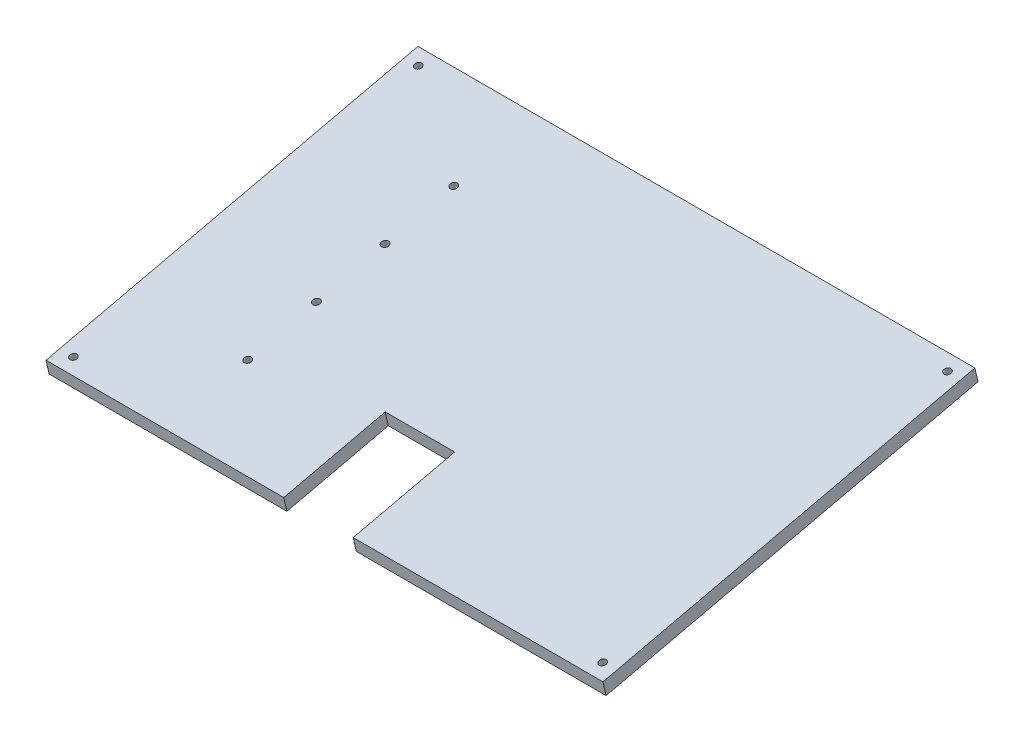
ISO-10303-21;
HEADER;
FILE_DESCRIPTION(('STEP AP214'),'2;1');
FILE_NAME('part.step','',(''),(''),'','','');
FILE_SCHEMA(('AUTOMOTIVE_DESIGN { 1 0 10303 214 1 1 1 1 }'));
ENDSEC;
DATA;
#1=APPLICATION_CONTEXT('core data for automotive mechanical design processes');
#2=APPLICATION_PROTOCOL_DEFINITION('international standard','automotive_design',2000,#1);
#3=PRODUCT_CONTEXT('',#1,'mechanical');
#4=PRODUCT('Part','Part','',(#3));
#5=PRODUCT_RELATED_PRODUCT_CATEGORY('part','',(#4));
#6=PRODUCT_DEFINITION_FORMATION('','',#4);
#7=PRODUCT_DEFINITION_CONTEXT('part definition',#1,'design');
#8=PRODUCT_DEFINITION('design','',#6,#7);
#9=PRODUCT_DEFINITION_SHAPE('','',#8);
#10=(LENGTH_UNIT() NAMED_UNIT(*) SI_UNIT(.MILLI.,.METRE.));
#11=(NAMED_UNIT(*) PLANE_ANGLE_UNIT() SI_UNIT($,.RADIAN.));
#12=(NAMED_UNIT(*) SI_UNIT($,.STERADIAN.) SOLID_ANGLE_UNIT());
#13=UNCERTAINTY_MEASURE_WITH_UNIT(LENGTH_MEASURE(1.E-05),#10,'distance_accuracy_value','');
#14=(GEOMETRIC_REPRESENTATION_CONTEXT(3) GLOBAL_UNCERTAINTY_ASSIGNED_CONTEXT((#13)) GLOBAL_UNIT_ASSIGNED_CONTEXT((#10,
#11,#12)) REPRESENTATION_CONTEXT('',''));
#15=CARTESIAN_POINT('',(0.,0.,0.));
#16=DIRECTION('',(0.,0.,1.));
#17=DIRECTION('',(1.,0.,0.));
#18=AXIS2_PLACEMENT_3D('',#15,#16,#17);
#19=CARTESIAN_POINT('',(-1069.36551774697,101.974773649402,545.336502329348));
#20=DIRECTION('',(0.,-0.974370064785234,-0.224951054343872));
#21=DIRECTION('',(1.,0.,0.));
#22=AXIS2_PLACEMENT_3D('',#19,#20,#21);
#23=CYLINDRICAL_SURFACE('',#22,2.54);
#24=CARTESIAN_POINT('',(-1069.36551774697,101.974773649402,545.336502329348));
#25=DIRECTION('',(0.,-0.974370064785234,-0.224951054343872));
#26=DIRECTION('',(1.,0.,0.));
#27=AXIS2_PLACEMENT_3D('',#24,#25,#26);
#28=CIRCLE('',#27,2.54);
#29=CARTESIAN_POINT('',(-1071.90551774697,101.974773649402,545.336502329348));
#30=VERTEX_POINT('',#29);
#31=EDGE_CURVE('E199',#30,#30,#28,.T.);
#32=ORIENTED_EDGE('',*,*,#31,.F.);
#33=DIRECTION('',(0.,-0.974370064785234,-0.224951054343872));
#34=VECTOR('',#33,1.);
#35=CARTESIAN_POINT('',(-1071.90551774697,101.974773649402,545.336502329348));
#36=LINE('',#35,#34);
#37=CARTESIAN_POINT('',(-1071.90551774697,92.2310730015492,543.086991785909));
#38=VERTEX_POINT('',#37);
#39=EDGE_CURVE('E10',#30,#38,#36,.T.);
#40=ORIENTED_EDGE('',*,*,#39,.T.);
#41=CARTESIAN_POINT('',(-1069.36551774697,92.2310730015493,543.086991785909));
#42=DIRECTION('',(0.,0.974370064785234,0.224951054343872));
#43=DIRECTION('',(1.,0.,0.));
#44=AXIS2_PLACEMENT_3D('',#41,#42,#43);
#45=CIRCLE('',#44,2.54);
#46=EDGE_CURVE('E188',#38,#38,#45,.T.);
#47=ORIENTED_EDGE('',*,*,#46,.F.);
#48=ORIENTED_EDGE('',*,*,#39,.F.);
#49=EDGE_LOOP('',(#32,#40,#47,#48));
#50=FACE_BOUND('',#49,.T.);
#51=ADVANCED_FACE('F16',(#50),#23,.F.);
#52=CARTESIAN_POINT('',(-1069.36551774697,113.40228721007,495.838503038258));
#53=DIRECTION('',(0.,-0.974370064785234,-0.224951054343872));
#54=DIRECTION('',(1.,0.,0.));
#55=AXIS2_PLACEMENT_3D('',#52,#53,#54);
#56=CYLINDRICAL_SURFACE('',#55,2.54);
#57=CARTESIAN_POINT('',(-1069.36551774697,113.40228721007,495.838503038258));
#58=DIRECTION('',(0.,-0.974370064785234,-0.224951054343872));
#59=DIRECTION('',(1.,0.,0.));
#60=AXIS2_PLACEMENT_3D('',#57,#58,#59);
#61=CIRCLE('',#60,2.54);
#62=CARTESIAN_POINT('',(-1071.90551774697,113.40228721007,495.838503038258));
#63=VERTEX_POINT('',#62);
#64=EDGE_CURVE('E175',#63,#63,#61,.T.);
#65=ORIENTED_EDGE('',*,*,#64,.F.);
#66=DIRECTION('',(0.,-0.974370064785234,-0.224951054343872));
#67=VECTOR('',#66,1.);
#68=CARTESIAN_POINT('',(-1071.90551774697,113.40228721007,495.838503038258));
#69=LINE('',#68,#67);
#70=CARTESIAN_POINT('',(-1071.90551774697,103.658586562218,493.588992494819));
#71=VERTEX_POINT('',#70);
#72=EDGE_CURVE('E27',#63,#71,#69,.T.);
#73=ORIENTED_EDGE('',*,*,#72,.T.);
#74=CARTESIAN_POINT('',(-1069.36551774697,103.658586562218,493.588992494819));
#75=DIRECTION('',(0.,0.974370064785234,0.224951054343872));
#76=DIRECTION('',(1.,0.,0.));
#77=AXIS2_PLACEMENT_3D('',#74,#75,#76);
#78=CIRCLE('',#77,2.54);
#79=EDGE_CURVE('E184',#71,#71,#78,.T.);
#80=ORIENTED_EDGE('',*,*,#79,.F.);
#81=ORIENTED_EDGE('',*,*,#72,.F.);
#82=EDGE_LOOP('',(#65,#73,#80,#81));
#83=FACE_BOUND('',#82,.T.);
#84=ADVANCED_FACE('F384',(#83),#56,.F.);
#85=CARTESIAN_POINT('',(-1069.36551774697,90.5472600887329,594.834501620438));
#86=DIRECTION('',(0.,-0.974370064785234,-0.224951054343872));
#87=DIRECTION('',(1.,0.,0.));
#88=AXIS2_PLACEMENT_3D('',#85,#86,#87);
#89=CYLINDRICAL_SURFACE('',#88,2.54);
#90=CARTESIAN_POINT('',(-1069.36551774697,90.547260088733,594.834501620438));
#91=DIRECTION('',(0.,-0.974370064785234,-0.224951054343872));
#92=DIRECTION('',(1.,0.,0.));
#93=AXIS2_PLACEMENT_3D('',#90,#91,#92);
#94=CIRCLE('',#93,2.54);
#95=CARTESIAN_POINT('',(-1071.90551774697,90.547260088733,594.834501620438));
#96=VERTEX_POINT('',#95);
#97=EDGE_CURVE('E170',#96,#96,#94,.T.);
#98=ORIENTED_EDGE('',*,*,#97,.F.);
#99=DIRECTION('',(0.,-0.974370064785234,-0.224951054343872));
#100=VECTOR('',#99,1.);
#101=CARTESIAN_POINT('',(-1071.90551774697,90.5472600887329,594.834501620438));
#102=LINE('',#101,#100);
#103=CARTESIAN_POINT('',(-1071.90551774697,80.8035594408805,592.584991076999));
#104=VERTEX_POINT('',#103);
#105=EDGE_CURVE('E180',#96,#104,#102,.T.);
#106=ORIENTED_EDGE('',*,*,#105,.T.);
#107=CARTESIAN_POINT('',(-1069.36551774697,80.8035594408807,592.584991076999));
#108=DIRECTION('',(0.,0.974370064785234,0.224951054343872));
#109=DIRECTION('',(1.,0.,0.));
#110=AXIS2_PLACEMENT_3D('',#107,#108,#109);
#111=CIRCLE('',#110,2.54);
#112=EDGE_CURVE('E189',#104,#104,#111,.T.);
#113=ORIENTED_EDGE('',*,*,#112,.F.);
#114=ORIENTED_EDGE('',*,*,#105,.F.);
#115=EDGE_LOOP('',(#98,#106,#113,#114));
#116=FACE_BOUND('',#115,.T.);
#117=ADVANCED_FACE('F379',(#116),#89,.F.);
#118=CARTESIAN_POINT('',(-1069.36551774697,124.829800770739,446.340503747168));
#119=DIRECTION('',(0.,-0.974370064785234,-0.224951054343872));
#120=DIRECTION('',(1.,0.,0.));
#121=AXIS2_PLACEMENT_3D('',#118,#119,#120);
#122=CYLINDRICAL_SURFACE('',#121,2.54);
#123=CARTESIAN_POINT('',(-1069.36551774697,124.829800770739,446.340503747168));
#124=DIRECTION('',(0.,-0.974370064785234,-0.224951054343872));
#125=DIRECTION('',(1.,0.,0.));
#126=AXIS2_PLACEMENT_3D('',#123,#124,#125);
#127=CIRCLE('',#126,2.54);
#128=CARTESIAN_POINT('',(-1071.90551774697,124.829800770739,446.340503747168));
#129=VERTEX_POINT('',#128);
#130=EDGE_CURVE('E174',#129,#129,#127,.T.);
#131=ORIENTED_EDGE('',*,*,#130,.F.);
#132=DIRECTION('',(0.,-0.974370064785234,-0.224951054343872));
#133=VECTOR('',#132,1.);
#134=CARTESIAN_POINT('',(-1071.90551774697,124.829800770739,446.340503747168));
#135=LINE('',#134,#133);
#136=CARTESIAN_POINT('',(-1071.90551774697,115.086100122887,444.090993203729));
#137=VERTEX_POINT('',#136);
#138=EDGE_CURVE('E176',#129,#137,#135,.T.);
#139=ORIENTED_EDGE('',*,*,#138,.T.);
#140=CARTESIAN_POINT('',(-1069.36551774697,115.086100122887,444.090993203729));
#141=DIRECTION('',(0.,0.974370064785234,0.224951054343872));
#142=DIRECTION('',(1.,0.,0.));
#143=AXIS2_PLACEMENT_3D('',#140,#141,#142);
#144=CIRCLE('',#143,2.54);
#145=EDGE_CURVE('E277',#137,#137,#144,.T.);
#146=ORIENTED_EDGE('',*,*,#145,.F.);
#147=ORIENTED_EDGE('',*,*,#138,.F.);
#148=EDGE_LOOP('',(#131,#139,#146,#147));
#149=FACE_BOUND('',#148,.T.);
#150=ADVANCED_FACE('F611',(#149),#122,.F.);
#151=CARTESIAN_POINT('',(-984.124223131464,76.8702359846253,654.07620155938));
#152=DIRECTION('',(0.,0.224951054343872,-0.974370064785234));
#153=DIRECTION('',(-1.,0.,0.));
#154=AXIS2_PLACEMENT_3D('',#151,#152,#153);
#155=PLANE('',#154);
#156=DIRECTION('',(0.,-0.974370064785234,-0.224951054343872));
#157=VECTOR('',#156,1.);
#158=CARTESIAN_POINT('',(-1155.4504158531,76.8702359846252,654.07620155938));
#159=LINE('',#158,#157);
#160=CARTESIAN_POINT('',(-1155.4504158531,76.870235984625,654.07620155938));
#161=VERTEX_POINT('',#160);
#162=CARTESIAN_POINT('',(-1155.4504158531,67.126535336773,651.826691015941));
#163=VERTEX_POINT('',#162);
#164=EDGE_CURVE('E257',#161,#163,#159,.T.);
#165=ORIENTED_EDGE('',*,*,#164,.T.);
#166=DIRECTION('',(1.,0.,0.));
#167=VECTOR('',#166,1.);
#168=CARTESIAN_POINT('',(-1160.4504158531,67.126535336773,651.826691015941));
#169=LINE('',#168,#167);
#170=CARTESIAN_POINT('',(-984.124223131464,67.126535336773,651.826691015941));
#171=VERTEX_POINT('',#170);
#172=EDGE_CURVE('E214',#163,#171,#169,.T.);
#173=ORIENTED_EDGE('',*,*,#172,.T.);
#174=DIRECTION('',(0.,-0.974370064785233,-0.224951054343875));
#175=VECTOR('',#174,1.);
#176=CARTESIAN_POINT('',(-984.124223131464,76.8702359846253,654.07620155938));
#177=LINE('',#176,#175);
#178=CARTESIAN_POINT('',(-984.124223131464,76.8702359846253,654.07620155938));
#179=VERTEX_POINT('',#178);
#180=EDGE_CURVE('E20',#179,#171,#177,.T.);
#181=ORIENTED_EDGE('',*,*,#180,.F.);
#182=DIRECTION('',(1.,0.,0.));
#183=VECTOR('',#182,1.);
#184=CARTESIAN_POINT('',(-1160.4504158531,76.8702359846253,654.07620155938));
#185=LINE('',#184,#183);
#186=EDGE_CURVE('E222',#161,#179,#185,.T.);
#187=ORIENTED_EDGE('',*,*,#186,.F.);
#188=EDGE_LOOP('',(#165,#173,#181,#187));
#189=FACE_BOUND('',#188,.T.);
#190=ADVANCED_FACE('F352',(#189),#155,.F.);
#191=CARTESIAN_POINT('',(-984.124223131464,93.7415650604157,580.998446700488));
#192=DIRECTION('',(-1.,0.,0.));
#193=DIRECTION('',(0.,1.,0.));
#194=AXIS2_PLACEMENT_3D('',#191,#192,#193);
#195=PLANE('',#194);
#196=DIRECTION('',(0.,0.224951054343872,-0.974370064785234));
#197=VECTOR('',#196,1.);
#198=CARTESIAN_POINT('',(-984.124223131464,67.126535336773,651.826691015941));
#199=LINE('',#198,#197);
#200=CARTESIAN_POINT('',(-984.124223131464,83.9978644125634,578.748936157049));
#201=VERTEX_POINT('',#200);
#202=EDGE_CURVE('E211',#171,#201,#199,.T.);
#203=ORIENTED_EDGE('',*,*,#202,.T.);
#204=DIRECTION('',(0.,-0.974370064785234,-0.224951054343869));
#205=VECTOR('',#204,1.);
#206=CARTESIAN_POINT('',(-984.124223131464,93.7415650604157,580.998446700488));
#207=LINE('',#206,#205);
#208=CARTESIAN_POINT('',(-984.124223131464,93.7415650604157,580.998446700488));
#209=VERTEX_POINT('',#208);
#210=EDGE_CURVE('E103',#209,#201,#207,.T.);
#211=ORIENTED_EDGE('',*,*,#210,.F.);
#212=DIRECTION('',(0.,0.224951054343872,-0.974370064785234));
#213=VECTOR('',#212,1.);
#214=CARTESIAN_POINT('',(-984.124223131464,76.8702359846253,654.07620155938));
#215=LINE('',#214,#213);
#216=EDGE_CURVE('E225',#179,#209,#215,.T.);
#217=ORIENTED_EDGE('',*,*,#216,.F.);
#218=ORIENTED_EDGE('',*,*,#180,.T.);
#219=EDGE_LOOP('',(#203,#211,#217,#218));
#220=FACE_BOUND('',#219,.T.);
#221=ADVANCED_FACE('F409',(#220),#195,.F.);
#222=CARTESIAN_POINT('',(-934.124223131464,93.7415650604157,580.998446700488));
#223=DIRECTION('',(0.,0.224951054343872,-0.974370064785234));
#224=DIRECTION('',(-1.,0.,0.));
#225=AXIS2_PLACEMENT_3D('',#222,#223,#224);
#226=PLANE('',#225);
#227=DIRECTION('',(1.,0.,0.));
#228=VECTOR('',#227,1.);
#229=CARTESIAN_POINT('',(-984.124223131464,83.9978644125634,578.748936157049));
#230=LINE('',#229,#228);
#231=CARTESIAN_POINT('',(-934.124223131464,83.9978644125634,578.748936157049));
#232=VERTEX_POINT('',#231);
#233=EDGE_CURVE('E183',#201,#232,#230,.T.);
#234=ORIENTED_EDGE('',*,*,#233,.T.);
#235=DIRECTION('',(0.,-0.974370064785234,-0.224951054343869));
#236=VECTOR('',#235,1.);
#237=CARTESIAN_POINT('',(-934.124223131464,93.7415650604157,580.998446700488));
#238=LINE('',#237,#236);
#239=CARTESIAN_POINT('',(-934.124223131464,93.7415650604157,580.998446700488));
#240=VERTEX_POINT('',#239);
#241=EDGE_CURVE('E302',#240,#232,#238,.T.);
#242=ORIENTED_EDGE('',*,*,#241,.F.);
#243=DIRECTION('',(1.,0.,0.));
#244=VECTOR('',#243,1.);
#245=CARTESIAN_POINT('',(-984.124223131464,93.7415650604157,580.998446700488));
#246=LINE('',#245,#244);
#247=EDGE_CURVE('E162',#209,#240,#246,.T.);
#248=ORIENTED_EDGE('',*,*,#247,.F.);
#249=ORIENTED_EDGE('',*,*,#210,.T.);
#250=EDGE_LOOP('',(#234,#242,#248,#249));
#251=FACE_BOUND('',#250,.T.);
#252=ADVANCED_FACE('F406',(#251),#226,.F.);
#253=CARTESIAN_POINT('',(-934.124223131464,76.8702359846253,654.07620155938));
#254=DIRECTION('',(1.,0.,0.));
#255=DIRECTION('',(0.,1.,0.));
#256=AXIS2_PLACEMENT_3D('',#253,#254,#255);
#257=PLANE('',#256);
#258=DIRECTION('',(0.,-0.224951054343872,0.974370064785234));
#259=VECTOR('',#258,1.);
#260=CARTESIAN_POINT('',(-934.124223131464,83.9978644125634,578.748936157049));
#261=LINE('',#260,#259);
#262=CARTESIAN_POINT('',(-934.124223131464,67.126535336773,651.826691015941));
#263=VERTEX_POINT('',#262);
#264=EDGE_CURVE('E126',#232,#263,#261,.T.);
#265=ORIENTED_EDGE('',*,*,#264,.T.);
#266=DIRECTION('',(0.,-0.974370064785233,-0.224951054343875));
#267=VECTOR('',#266,1.);
#268=CARTESIAN_POINT('',(-934.124223131464,76.8702359846253,654.07620155938));
#269=LINE('',#268,#267);
#270=CARTESIAN_POINT('',(-934.124223131464,76.8702359846253,654.07620155938));
#271=VERTEX_POINT('',#270);
#272=EDGE_CURVE('E203',#271,#263,#269,.T.);
#273=ORIENTED_EDGE('',*,*,#272,.F.);
#274=DIRECTION('',(0.,-0.224951054343872,0.974370064785234));
#275=VECTOR('',#274,1.);
#276=CARTESIAN_POINT('',(-934.124223131464,93.7415650604157,580.998446700488));
#277=LINE('',#276,#275);
#278=EDGE_CURVE('E251',#240,#271,#277,.T.);
#279=ORIENTED_EDGE('',*,*,#278,.F.);
#280=ORIENTED_EDGE('',*,*,#241,.T.);
#281=EDGE_LOOP('',(#265,#273,#279,#280));
#282=FACE_BOUND('',#281,.T.);
#283=ADVANCED_FACE('F387',(#282),#257,.F.);
#284=CARTESIAN_POINT('',(0.,206.600739847275,47.6975390937449));
#285=DIRECTION('',(0.,0.974370064785234,0.224951054343872));
#286=DIRECTION('',(1.,0.,0.));
#287=AXIS2_PLACEMENT_3D('',#284,#285,#286);
#288=PLANE('',#287);
#289=ORIENTED_EDGE('',*,*,#46,.T.);
#290=EDGE_LOOP('',(#289));
#291=FACE_BOUND('',#290,.T.);
#292=ORIENTED_EDGE('',*,*,#79,.T.);
#293=EDGE_LOOP('',(#292));
#294=FACE_BOUND('',#293,.T.);
#295=ORIENTED_EDGE('',*,*,#112,.T.);
#296=EDGE_LOOP('',(#295));
#297=FACE_BOUND('',#296,.T.);
#298=ORIENTED_EDGE('',*,*,#145,.T.);
#299=EDGE_LOOP('',(#298));
#300=FACE_BOUND('',#299,.T.);
#301=CARTESIAN_POINT('',(-764.124223131464,69.3760458802115,642.082990368089));
#302=DIRECTION('',(0.,0.974370064785234,0.224951054343872));
#303=DIRECTION('',(1.,0.,0.));
#304=AXIS2_PLACEMENT_3D('',#301,#302,#303);
#305=CIRCLE('',#304,2.5);
#306=CARTESIAN_POINT('',(-766.624223131464,69.3760458802116,642.082990368089));
#307=VERTEX_POINT('',#306);
#308=EDGE_CURVE('E194',#307,#307,#305,.T.);
#309=ORIENTED_EDGE('',*,*,#308,.T.);
#310=EDGE_LOOP('',(#309));
#311=FACE_BOUND('',#310,.T.);
#312=CARTESIAN_POINT('',(-1145.4504158531,126.738564737899,393.618623847855));
#313=DIRECTION('',(0.,0.974370064785234,0.224951054343872));
#314=DIRECTION('',(1.,0.,0.));
#315=AXIS2_PLACEMENT_3D('',#312,#313,#314);
#316=CIRCLE('',#315,2.5);
#317=CARTESIAN_POINT('',(-1147.9504158531,126.738564737899,393.618623847855));
#318=VERTEX_POINT('',#317);
#319=EDGE_CURVE('E168',#318,#318,#316,.T.);
#320=ORIENTED_EDGE('',*,*,#319,.T.);
#321=EDGE_LOOP('',(#320));
#322=FACE_BOUND('',#321,.T.);
#323=CARTESIAN_POINT('',(-1145.4504158531,69.3760458802117,642.082990368089));
#324=DIRECTION('',(0.,0.974370064785234,0.224951054343872));
#325=DIRECTION('',(1.,0.,0.));
#326=AXIS2_PLACEMENT_3D('',#323,#324,#325);
#327=CIRCLE('',#326,2.5);
#328=CARTESIAN_POINT('',(-1147.9504158531,69.3760458802117,642.082990368089));
#329=VERTEX_POINT('',#328);
#330=EDGE_CURVE('E262',#329,#329,#327,.T.);
#331=ORIENTED_EDGE('',*,*,#330,.T.);
#332=EDGE_LOOP('',(#331));
#333=FACE_BOUND('',#332,.T.);
#334=CARTESIAN_POINT('',(-764.124223131464,126.738564737899,393.618623847854));
#335=DIRECTION('',(0.,0.974370064785234,0.224951054343872));
#336=DIRECTION('',(1.,0.,0.));
#337=AXIS2_PLACEMENT_3D('',#334,#335,#336);
#338=CIRCLE('',#337,2.5);
#339=CARTESIAN_POINT('',(-766.624223131464,126.738564737899,393.618623847855));
#340=VERTEX_POINT('',#339);
#341=EDGE_CURVE('E149',#340,#340,#338,.T.);
#342=ORIENTED_EDGE('',*,*,#341,.T.);
#343=EDGE_LOOP('',(#342));
#344=FACE_BOUND('',#343,.T.);
#345=DIRECTION('',(0.,0.224951054343872,-0.974370064785234));
#346=VECTOR('',#345,1.);
#347=CARTESIAN_POINT('',(-1155.4504158531,167.794407564307,215.786231146874));
#348=LINE('',#347,#346);
#349=CARTESIAN_POINT('',(-1155.4504158531,128.988075281338,383.874923200002));
#350=VERTEX_POINT('',#349);
#351=EDGE_CURVE('E261',#163,#350,#348,.T.);
#352=ORIENTED_EDGE('',*,*,#351,.T.);
#353=DIRECTION('',(-1.,0.,0.));
#354=VECTOR('',#353,1.);
#355=CARTESIAN_POINT('',(-749.124223131464,128.988075281338,383.874923200002));
#356=LINE('',#355,#354);
#357=CARTESIAN_POINT('',(-754.124223131464,128.988075281338,383.874923200002));
#358=VERTEX_POINT('',#357);
#359=EDGE_CURVE('E226',#358,#350,#356,.T.);
#360=ORIENTED_EDGE('',*,*,#359,.F.);
#361=DIRECTION('',(0.,-0.224951054343872,0.974370064785234));
#362=VECTOR('',#361,1.);
#363=CARTESIAN_POINT('',(-754.124223131464,136.863637592024,349.762115054843));
#364=LINE('',#363,#362);
#365=CARTESIAN_POINT('',(-754.124223131464,67.1265353367728,651.826691015941));
#366=VERTEX_POINT('',#365);
#367=EDGE_CURVE('E210',#358,#366,#364,.T.);
#368=ORIENTED_EDGE('',*,*,#367,.T.);
#369=DIRECTION('',(1.,0.,0.));
#370=VECTOR('',#369,1.);
#371=CARTESIAN_POINT('',(-934.124223131464,67.126535336773,651.826691015941));
#372=LINE('',#371,#370);
#373=EDGE_CURVE('E200',#263,#366,#372,.T.);
#374=ORIENTED_EDGE('',*,*,#373,.F.);
#375=ORIENTED_EDGE('',*,*,#264,.F.);
#376=ORIENTED_EDGE('',*,*,#233,.F.);
#377=ORIENTED_EDGE('',*,*,#202,.F.);
#378=ORIENTED_EDGE('',*,*,#172,.F.);
#379=EDGE_LOOP('',(#352,#360,#368,#374,#375,#376,#377,#378));
#380=FACE_BOUND('',#379,.T.);
#381=ADVANCED_FACE('F333',(#291,#294,#297,#300,#311,#322,#333,#344,#380),#288,.F.);
#382=CARTESIAN_POINT('',(0.,216.344440495127,49.9470496371837));
#383=DIRECTION('',(0.,0.974370064785234,0.224951054343872));
#384=DIRECTION('',(1.,0.,0.));
#385=AXIS2_PLACEMENT_3D('',#382,#383,#384);
#386=PLANE('',#385);
#387=CARTESIAN_POINT('',(-764.124223131464,136.482265385751,395.868134391293));
#388=DIRECTION('',(0.,-0.974370064785234,-0.224951054343872));
#389=DIRECTION('',(1.,0.,0.));
#390=AXIS2_PLACEMENT_3D('',#387,#388,#389);
#391=CIRCLE('',#390,2.5);
#392=CARTESIAN_POINT('',(-766.624223131464,136.482265385751,395.868134391293));
#393=VERTEX_POINT('',#392);
#394=EDGE_CURVE('E148',#393,#393,#391,.T.);
#395=ORIENTED_EDGE('',*,*,#394,.T.);
#396=EDGE_LOOP('',(#395));
#397=FACE_BOUND('',#396,.T.);
#398=CARTESIAN_POINT('',(-1145.4504158531,79.1197465280637,644.332500911527));
#399=DIRECTION('',(0.,-0.974370064785234,-0.224951054343872));
#400=DIRECTION('',(1.,0.,0.));
#401=AXIS2_PLACEMENT_3D('',#398,#399,#400);
#402=CIRCLE('',#401,2.5);
#403=CARTESIAN_POINT('',(-1147.9504158531,79.1197465280638,644.332500911527));
#404=VERTEX_POINT('',#403);
#405=EDGE_CURVE('E242',#404,#404,#402,.T.);
#406=ORIENTED_EDGE('',*,*,#405,.T.);
#407=EDGE_LOOP('',(#406));
#408=FACE_BOUND('',#407,.T.);
#409=CARTESIAN_POINT('',(-1145.4504158531,136.482265385751,395.868134391293));
#410=DIRECTION('',(0.,-0.974370064785234,-0.224951054343872));
#411=DIRECTION('',(1.,0.,0.));
#412=AXIS2_PLACEMENT_3D('',#409,#410,#411);
#413=CIRCLE('',#412,2.5);
#414=CARTESIAN_POINT('',(-1147.9504158531,136.482265385751,395.868134391293));
#415=VERTEX_POINT('',#414);
#416=EDGE_CURVE('E169',#415,#415,#413,.T.);
#417=ORIENTED_EDGE('',*,*,#416,.T.);
#418=EDGE_LOOP('',(#417));
#419=FACE_BOUND('',#418,.T.);
#420=CARTESIAN_POINT('',(-764.124223131464,79.1197465280636,644.332500911527));
#421=DIRECTION('',(0.,-0.974370064785234,-0.224951054343872));
#422=DIRECTION('',(1.,0.,0.));
#423=AXIS2_PLACEMENT_3D('',#420,#421,#422);
#424=CIRCLE('',#423,2.5);
#425=CARTESIAN_POINT('',(-766.624223131464,79.1197465280636,644.332500911527));
#426=VERTEX_POINT('',#425);
#427=EDGE_CURVE('E195',#426,#426,#424,.T.);
#428=ORIENTED_EDGE('',*,*,#427,.T.);
#429=EDGE_LOOP('',(#428));
#430=FACE_BOUND('',#429,.T.);
#431=ORIENTED_EDGE('',*,*,#130,.T.);
#432=EDGE_LOOP('',(#431));
#433=FACE_BOUND('',#432,.T.);
#434=ORIENTED_EDGE('',*,*,#97,.T.);
#435=EDGE_LOOP('',(#434));
#436=FACE_BOUND('',#435,.T.);
#437=ORIENTED_EDGE('',*,*,#64,.T.);
#438=EDGE_LOOP('',(#437));
#439=FACE_BOUND('',#438,.T.);
#440=ORIENTED_EDGE('',*,*,#31,.T.);
#441=EDGE_LOOP('',(#440));
#442=FACE_BOUND('',#441,.T.);
#443=DIRECTION('',(0.,-0.224951054343872,0.974370064785234));
#444=VECTOR('',#443,1.);
#445=CARTESIAN_POINT('',(-1155.4504158531,177.538108212159,218.035741690312));
#446=LINE('',#445,#444);
#447=CARTESIAN_POINT('',(-1155.4504158531,138.73177592919,386.124433743441));
#448=VERTEX_POINT('',#447);
#449=EDGE_CURVE('E247',#448,#161,#446,.T.);
#450=ORIENTED_EDGE('',*,*,#449,.T.);
#451=ORIENTED_EDGE('',*,*,#186,.T.);
#452=ORIENTED_EDGE('',*,*,#216,.T.);
#453=ORIENTED_EDGE('',*,*,#247,.T.);
#454=ORIENTED_EDGE('',*,*,#278,.T.);
#455=DIRECTION('',(1.,0.,0.));
#456=VECTOR('',#455,1.);
#457=CARTESIAN_POINT('',(-934.124223131464,76.8702359846253,654.07620155938));
#458=LINE('',#457,#456);
#459=CARTESIAN_POINT('',(-754.124223131464,76.8702359846249,654.07620155938));
#460=VERTEX_POINT('',#459);
#461=EDGE_CURVE('E301',#271,#460,#458,.T.);
#462=ORIENTED_EDGE('',*,*,#461,.T.);
#463=DIRECTION('',(0.,0.224951054343872,-0.974370064785234));
#464=VECTOR('',#463,1.);
#465=CARTESIAN_POINT('',(-754.124223131464,146.607338239876,352.011625598282));
#466=LINE('',#465,#464);
#467=CARTESIAN_POINT('',(-754.124223131464,138.73177592919,386.124433743441));
#468=VERTEX_POINT('',#467);
#469=EDGE_CURVE('E209',#460,#468,#466,.T.);
#470=ORIENTED_EDGE('',*,*,#469,.T.);
#471=DIRECTION('',(-1.,0.,0.));
#472=VECTOR('',#471,1.);
#473=CARTESIAN_POINT('',(-749.124223131464,138.73177592919,386.124433743441));
#474=LINE('',#473,#472);
#475=EDGE_CURVE('E202',#468,#448,#474,.T.);
#476=ORIENTED_EDGE('',*,*,#475,.T.);
#477=EDGE_LOOP('',(#450,#451,#452,#453,#454,#462,#470,#476));
#478=FACE_BOUND('',#477,.T.);
#479=ADVANCED_FACE('F153',(#397,#408,#419,#430,#433,#436,#439,#442,#478),#386,.T.);
#480=CARTESIAN_POINT('',(-1160.4504158531,138.73177592919,386.124433743441));
#481=DIRECTION('',(0.,-0.224951054343872,0.974370064785234));
#482=DIRECTION('',(-1.,0.,0.));
#483=AXIS2_PLACEMENT_3D('',#480,#481,#482);
#484=PLANE('',#483);
#485=DIRECTION('',(0.,0.974370064785234,0.224951054343872));
#486=VECTOR('',#485,1.);
#487=CARTESIAN_POINT('',(-1155.4504158531,138.73177592919,386.124433743441));
#488=LINE('',#487,#486);
#489=EDGE_CURVE('E243',#350,#448,#488,.T.);
#490=ORIENTED_EDGE('',*,*,#489,.T.);
#491=ORIENTED_EDGE('',*,*,#475,.F.);
#492=DIRECTION('',(0.,-0.974370064785234,-0.224951054343872));
#493=VECTOR('',#492,1.);
#494=CARTESIAN_POINT('',(-754.124223131464,138.73177592919,386.124433743441));
#495=LINE('',#494,#493);
#496=EDGE_CURVE('E205',#468,#358,#495,.T.);
#497=ORIENTED_EDGE('',*,*,#496,.T.);
#498=ORIENTED_EDGE('',*,*,#359,.T.);
#499=EDGE_LOOP('',(#490,#491,#497,#498));
#500=FACE_BOUND('',#499,.T.);
#501=ADVANCED_FACE('F18',(#500),#484,.F.);
#502=CARTESIAN_POINT('',(-934.124223131464,76.8702359846253,654.07620155938));
#503=DIRECTION('',(0.,0.224951054343872,-0.974370064785234));
#504=DIRECTION('',(-1.,0.,0.));
#505=AXIS2_PLACEMENT_3D('',#502,#503,#504);
#506=PLANE('',#505);
#507=DIRECTION('',(0.,0.974370064785234,0.224951054343872));
#508=VECTOR('',#507,1.);
#509=CARTESIAN_POINT('',(-754.124223131464,76.8702359846251,654.07620155938));
#510=LINE('',#509,#508);
#511=EDGE_CURVE('E221',#366,#460,#510,.T.);
#512=ORIENTED_EDGE('',*,*,#511,.T.);
#513=ORIENTED_EDGE('',*,*,#461,.F.);
#514=ORIENTED_EDGE('',*,*,#272,.T.);
#515=ORIENTED_EDGE('',*,*,#373,.T.);
#516=EDGE_LOOP('',(#512,#513,#514,#515));
#517=FACE_BOUND('',#516,.T.);
#518=ADVANCED_FACE('F403',(#517),#506,.F.);
#519=CARTESIAN_POINT('',(-754.124223131464,76.8702359846249,654.07620155938));
#520=DIRECTION('',(-1.,0.,0.));
#521=DIRECTION('',(0.,0.,1.));
#522=AXIS2_PLACEMENT_3D('',#519,#520,#521);
#523=PLANE('',#522);
#524=ORIENTED_EDGE('',*,*,#367,.F.);
#525=ORIENTED_EDGE('',*,*,#496,.F.);
#526=ORIENTED_EDGE('',*,*,#469,.F.);
#527=ORIENTED_EDGE('',*,*,#511,.F.);
#528=EDGE_LOOP('',(#524,#525,#526,#527));
#529=FACE_BOUND('',#528,.T.);
#530=ADVANCED_FACE('F402',(#529),#523,.F.);
#531=CARTESIAN_POINT('',(-764.124223131464,79.1197465280636,644.332500911527));
#532=DIRECTION('',(0.,-0.974370064785234,-0.224951054343872));
#533=DIRECTION('',(1.,0.,0.));
#534=AXIS2_PLACEMENT_3D('',#531,#532,#533);
#535=CYLINDRICAL_SURFACE('',#534,2.5);
#536=ORIENTED_EDGE('',*,*,#427,.F.);
#537=DIRECTION('',(0.,-0.974370064785234,-0.224951054343872));
#538=VECTOR('',#537,1.);
#539=CARTESIAN_POINT('',(-766.624223131464,79.1197465280636,644.332500911527));
#540=LINE('',#539,#538);
#541=EDGE_CURVE('E190',#426,#307,#540,.T.);
#542=ORIENTED_EDGE('',*,*,#541,.T.);
#543=ORIENTED_EDGE('',*,*,#308,.F.);
#544=ORIENTED_EDGE('',*,*,#541,.F.);
#545=EDGE_LOOP('',(#536,#542,#543,#544));
#546=FACE_BOUND('',#545,.T.);
#547=ADVANCED_FACE('F584',(#546),#535,.F.);
#548=CARTESIAN_POINT('',(-1145.4504158531,136.482265385751,395.868134391293));
#549=DIRECTION('',(0.,-0.974370064785234,-0.224951054343872));
#550=DIRECTION('',(1.,0.,0.));
#551=AXIS2_PLACEMENT_3D('',#548,#549,#550);
#552=CYLINDRICAL_SURFACE('',#551,2.5);
#553=ORIENTED_EDGE('',*,*,#416,.F.);
#554=DIRECTION('',(0.,-0.974370064785234,-0.224951054343872));
#555=VECTOR('',#554,1.);
#556=CARTESIAN_POINT('',(-1147.9504158531,136.482265385751,395.868134391293));
#557=LINE('',#556,#555);
#558=EDGE_CURVE('E164',#415,#318,#557,.T.);
#559=ORIENTED_EDGE('',*,*,#558,.T.);
#560=ORIENTED_EDGE('',*,*,#319,.F.);
#561=ORIENTED_EDGE('',*,*,#558,.F.);
#562=EDGE_LOOP('',(#553,#559,#560,#561));
#563=FACE_BOUND('',#562,.T.);
#564=ADVANCED_FACE('F616',(#563),#552,.F.);
#565=CARTESIAN_POINT('',(-1155.4504158531,138.73177592919,386.124433743441));
#566=DIRECTION('',(1.,0.,0.));
#567=DIRECTION('',(0.,-1.,0.));
#568=AXIS2_PLACEMENT_3D('',#565,#566,#567);
#569=PLANE('',#568);
#570=ORIENTED_EDGE('',*,*,#351,.F.);
#571=ORIENTED_EDGE('',*,*,#164,.F.);
#572=ORIENTED_EDGE('',*,*,#449,.F.);
#573=ORIENTED_EDGE('',*,*,#489,.F.);
#574=EDGE_LOOP('',(#570,#571,#572,#573));
#575=FACE_BOUND('',#574,.T.);
#576=ADVANCED_FACE('F350',(#575),#569,.F.);
#577=CARTESIAN_POINT('',(-1145.4504158531,79.1197465280638,644.332500911527));
#578=DIRECTION('',(0.,-0.974370064785234,-0.224951054343872));
#579=DIRECTION('',(1.,0.,0.));
#580=AXIS2_PLACEMENT_3D('',#577,#578,#579);
#581=CYLINDRICAL_SURFACE('',#580,2.5);
#582=ORIENTED_EDGE('',*,*,#405,.F.);
#583=DIRECTION('',(0.,-0.974370064785234,-0.224951054343872));
#584=VECTOR('',#583,1.);
#585=CARTESIAN_POINT('',(-1147.9504158531,79.1197465280638,644.332500911527));
#586=LINE('',#585,#584);
#587=EDGE_CURVE('E266',#404,#329,#586,.T.);
#588=ORIENTED_EDGE('',*,*,#587,.T.);
#589=ORIENTED_EDGE('',*,*,#330,.F.);
#590=ORIENTED_EDGE('',*,*,#587,.F.);
#591=EDGE_LOOP('',(#582,#588,#589,#590));
#592=FACE_BOUND('',#591,.T.);
#593=ADVANCED_FACE('F643',(#592),#581,.F.);
#594=CARTESIAN_POINT('',(-764.124223131464,136.482265385751,395.868134391293));
#595=DIRECTION('',(0.,-0.974370064785234,-0.224951054343872));
#596=DIRECTION('',(1.,0.,0.));
#597=AXIS2_PLACEMENT_3D('',#594,#595,#596);
#598=CYLINDRICAL_SURFACE('',#597,2.5);
#599=ORIENTED_EDGE('',*,*,#394,.F.);
#600=DIRECTION('',(0.,-0.974370064785234,-0.224951054343872));
#601=VECTOR('',#600,1.);
#602=CARTESIAN_POINT('',(-766.624223131464,136.482265385751,395.868134391293));
#603=LINE('',#602,#601);
#604=EDGE_CURVE('E145',#393,#340,#603,.T.);
#605=ORIENTED_EDGE('',*,*,#604,.T.);
#606=ORIENTED_EDGE('',*,*,#341,.F.);
#607=ORIENTED_EDGE('',*,*,#604,.F.);
#608=EDGE_LOOP('',(#599,#605,#606,#607));
#609=FACE_BOUND('',#608,.T.);
#610=ADVANCED_FACE('F147',(#609),#598,.F.);
#611=CLOSED_SHELL('',(#51,#84,#117,#150,#190,#221,#252,#283,#381,#479,#501,#518,#530,#547,#564,
#576,#593,#610));
#612=MANIFOLD_SOLID_BREP('B1',#611);
#613=ADVANCED_BREP_SHAPE_REPRESENTATION('',(#18,#612),#14);
#614=SHAPE_DEFINITION_REPRESENTATION(#9,#613);
ENDSEC;
END-ISO-10303-21;
